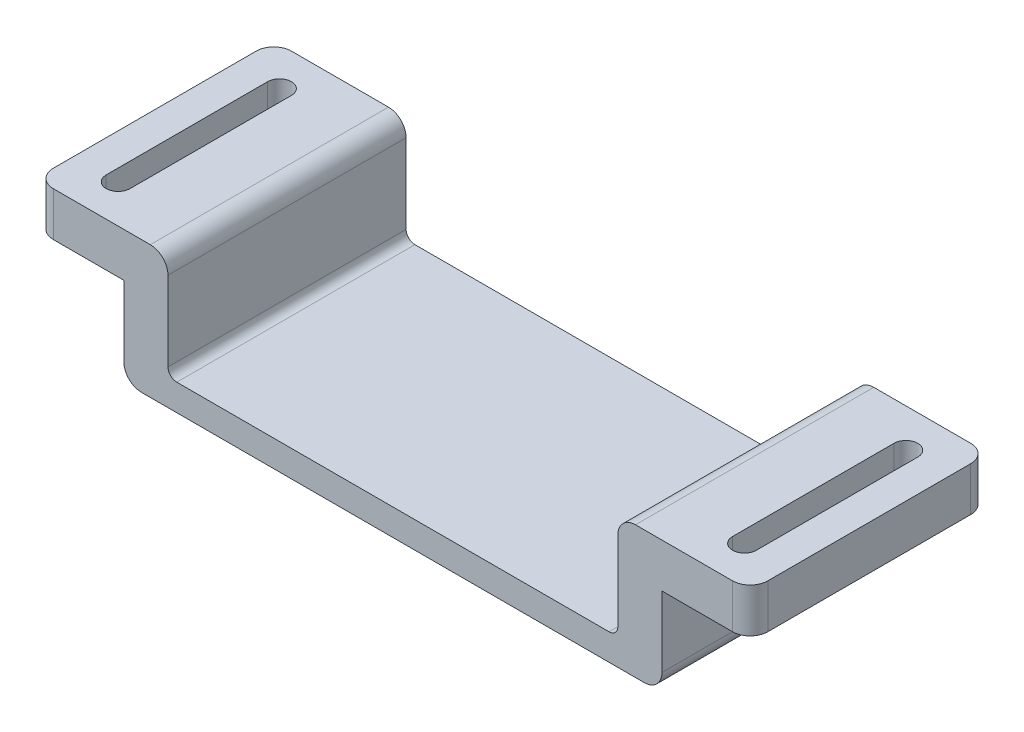
ISO-10303-21;
HEADER;
FILE_DESCRIPTION(('STEP AP214'),'2;1');
FILE_NAME('part.step','',(''),(''),'','','');
FILE_SCHEMA(('AUTOMOTIVE_DESIGN { 1 0 10303 214 1 1 1 1 }'));
ENDSEC;
DATA;
#1=APPLICATION_CONTEXT('core data for automotive mechanical design processes');
#2=APPLICATION_PROTOCOL_DEFINITION('international standard','automotive_design',2000,#1);
#3=PRODUCT_CONTEXT('',#1,'mechanical');
#4=PRODUCT('Part','Part','',(#3));
#5=PRODUCT_RELATED_PRODUCT_CATEGORY('part','',(#4));
#6=PRODUCT_DEFINITION_FORMATION('','',#4);
#7=PRODUCT_DEFINITION_CONTEXT('part definition',#1,'design');
#8=PRODUCT_DEFINITION('design','',#6,#7);
#9=PRODUCT_DEFINITION_SHAPE('','',#8);
#10=(LENGTH_UNIT() NAMED_UNIT(*) SI_UNIT(.MILLI.,.METRE.));
#11=(NAMED_UNIT(*) PLANE_ANGLE_UNIT() SI_UNIT($,.RADIAN.));
#12=(NAMED_UNIT(*) SI_UNIT($,.STERADIAN.) SOLID_ANGLE_UNIT());
#13=UNCERTAINTY_MEASURE_WITH_UNIT(LENGTH_MEASURE(1.E-05),#10,'distance_accuracy_value','');
#14=(GEOMETRIC_REPRESENTATION_CONTEXT(3) GLOBAL_UNCERTAINTY_ASSIGNED_CONTEXT((#13)) GLOBAL_UNIT_ASSIGNED_CONTEXT((#10,
#11,#12)) REPRESENTATION_CONTEXT('',''));
#15=CARTESIAN_POINT('',(0.,0.,0.));
#16=DIRECTION('',(0.,0.,1.));
#17=DIRECTION('',(1.,0.,0.));
#18=AXIS2_PLACEMENT_3D('',#15,#16,#17);
#19=CARTESIAN_POINT('',(0.,3.,0.));
#20=DIRECTION('',(0.,-1.,0.));
#21=DIRECTION('',(0.,0.,-1.));
#22=AXIS2_PLACEMENT_3D('',#19,#20,#21);
#23=PLANE('',#22);
#24=DIRECTION('',(-1.,0.,0.));
#25=VECTOR('',#24,1.);
#26=CARTESIAN_POINT('',(0.,3.,-27.));
#27=LINE('',#26,#25);
#28=CARTESIAN_POINT('',(55.,3.,-27.));
#29=VERTEX_POINT('',#28);
#30=CARTESIAN_POINT('',(6.,3.,-27.));
#31=VERTEX_POINT('',#30);
#32=EDGE_CURVE('E408',#29,#31,#27,.T.);
#33=ORIENTED_EDGE('',*,*,#32,.T.);
#34=DIRECTION('',(0.,0.,-1.));
#35=VECTOR('',#34,1.);
#36=CARTESIAN_POINT('',(6.,3.,0.));
#37=LINE('',#36,#35);
#38=CARTESIAN_POINT('',(6.,3.,0.));
#39=VERTEX_POINT('',#38);
#40=EDGE_CURVE('E548',#31,#39,#37,.F.);
#41=ORIENTED_EDGE('',*,*,#40,.T.);
#42=DIRECTION('',(1.,0.,0.));
#43=VECTOR('',#42,1.);
#44=CARTESIAN_POINT('',(0.,3.,0.));
#45=LINE('',#44,#43);
#46=CARTESIAN_POINT('',(55.,3.,0.));
#47=VERTEX_POINT('',#46);
#48=EDGE_CURVE('E404',#39,#47,#45,.T.);
#49=ORIENTED_EDGE('',*,*,#48,.T.);
#50=DIRECTION('',(0.,0.,1.));
#51=VECTOR('',#50,1.);
#52=CARTESIAN_POINT('',(55.,3.,-27.));
#53=LINE('',#52,#51);
#54=EDGE_CURVE('E545',#47,#29,#53,.F.);
#55=ORIENTED_EDGE('',*,*,#54,.T.);
#56=EDGE_LOOP('',(#33,#41,#49,#55));
#57=FACE_BOUND('',#56,.T.);
#58=ADVANCED_FACE('F39',(#57),#23,.F.);
#59=CARTESIAN_POINT('',(0.,3.,0.));
#60=DIRECTION('',(1.,0.,0.));
#61=DIRECTION('',(0.,0.,-1.));
#62=AXIS2_PLACEMENT_3D('',#59,#60,#61);
#63=PLANE('',#62);
#64=DIRECTION('',(0.,-1.,0.));
#65=VECTOR('',#64,1.);
#66=CARTESIAN_POINT('',(0.,3.,-27.));
#67=LINE('',#66,#65);
#68=CARTESIAN_POINT('',(0.,10.,-27.));
#69=VERTEX_POINT('',#68);
#70=CARTESIAN_POINT('',(0.,2.,-27.));
#71=VERTEX_POINT('',#70);
#72=EDGE_CURVE('E413',#69,#71,#67,.T.);
#73=ORIENTED_EDGE('',*,*,#72,.T.);
#74=DIRECTION('',(0.,0.,1.));
#75=VECTOR('',#74,1.);
#76=CARTESIAN_POINT('',(0.,2.,0.));
#77=LINE('',#76,#75);
#78=CARTESIAN_POINT('',(0.,2.,0.));
#79=VERTEX_POINT('',#78);
#80=EDGE_CURVE('E489',#71,#79,#77,.T.);
#81=ORIENTED_EDGE('',*,*,#80,.T.);
#82=DIRECTION('',(0.,-1.,0.));
#83=VECTOR('',#82,1.);
#84=CARTESIAN_POINT('',(0.,3.,0.));
#85=LINE('',#84,#83);
#86=CARTESIAN_POINT('',(0.,10.,0.));
#87=VERTEX_POINT('',#86);
#88=EDGE_CURVE('E431',#87,#79,#85,.T.);
#89=ORIENTED_EDGE('',*,*,#88,.F.);
#90=DIRECTION('',(0.,0.,1.));
#91=VECTOR('',#90,1.);
#92=CARTESIAN_POINT('',(0.,10.,-27.));
#93=LINE('',#92,#91);
#94=EDGE_CURVE('E391',#69,#87,#93,.T.);
#95=ORIENTED_EDGE('',*,*,#94,.F.);
#96=EDGE_LOOP('',(#73,#81,#89,#95));
#97=FACE_BOUND('',#96,.T.);
#98=ADVANCED_FACE('F617',(#97),#63,.F.);
#99=CARTESIAN_POINT('',(0.,3.,0.));
#100=DIRECTION('',(0.,0.,-1.));
#101=DIRECTION('',(-1.,0.,0.));
#102=AXIS2_PLACEMENT_3D('',#99,#100,#101);
#103=PLANE('',#102);
#104=ORIENTED_EDGE('',*,*,#88,.T.);
#105=CARTESIAN_POINT('',(2.,2.,0.));
#106=DIRECTION('',(0.,0.,-1.));
#107=DIRECTION('',(-1.,0.,0.));
#108=AXIS2_PLACEMENT_3D('',#105,#106,#107);
#109=CIRCLE('',#108,2.);
#110=CARTESIAN_POINT('',(2.,0.,0.));
#111=VERTEX_POINT('',#110);
#112=EDGE_CURVE('E502',#79,#111,#109,.F.);
#113=ORIENTED_EDGE('',*,*,#112,.T.);
#114=DIRECTION('',(1.,0.,0.));
#115=VECTOR('',#114,1.);
#116=CARTESIAN_POINT('',(0.,0.,0.));
#117=LINE('',#116,#115);
#118=CARTESIAN_POINT('',(59.,0.,0.));
#119=VERTEX_POINT('',#118);
#120=EDGE_CURVE('E403',#111,#119,#117,.T.);
#121=ORIENTED_EDGE('',*,*,#120,.T.);
#122=CARTESIAN_POINT('',(59.,2.,0.));
#123=DIRECTION('',(0.,0.,-1.));
#124=DIRECTION('',(-1.,0.,0.));
#125=AXIS2_PLACEMENT_3D('',#122,#123,#124);
#126=CIRCLE('',#125,2.);
#127=CARTESIAN_POINT('',(61.,2.,0.));
#128=VERTEX_POINT('',#127);
#129=EDGE_CURVE('E496',#119,#128,#126,.F.);
#130=ORIENTED_EDGE('',*,*,#129,.T.);
#131=DIRECTION('',(0.,-1.,0.));
#132=VECTOR('',#131,1.);
#133=CARTESIAN_POINT('',(61.,3.,0.));
#134=LINE('',#133,#132);
#135=CARTESIAN_POINT('',(61.,10.,0.));
#136=VERTEX_POINT('',#135);
#137=EDGE_CURVE('E427',#136,#128,#134,.T.);
#138=ORIENTED_EDGE('',*,*,#137,.F.);
#139=DIRECTION('',(1.,0.,0.));
#140=VECTOR('',#139,1.);
#141=CARTESIAN_POINT('',(56.,10.,0.));
#142=LINE('',#141,#140);
#143=CARTESIAN_POINT('',(69.,10.,0.));
#144=VERTEX_POINT('',#143);
#145=EDGE_CURVE('E288',#136,#144,#142,.T.);
#146=ORIENTED_EDGE('',*,*,#145,.T.);
#147=DIRECTION('',(0.,-1.,0.));
#148=VECTOR('',#147,1.);
#149=CARTESIAN_POINT('',(69.,3.,0.));
#150=LINE('',#149,#148);
#151=CARTESIAN_POINT('',(69.,15.,0.));
#152=VERTEX_POINT('',#151);
#153=EDGE_CURVE('E452',#144,#152,#150,.F.);
#154=ORIENTED_EDGE('',*,*,#153,.T.);
#155=DIRECTION('',(1.,0.,0.));
#156=VECTOR('',#155,1.);
#157=CARTESIAN_POINT('',(56.,15.,0.));
#158=LINE('',#157,#156);
#159=CARTESIAN_POINT('',(58.,15.,0.));
#160=VERTEX_POINT('',#159);
#161=EDGE_CURVE('E337',#160,#152,#158,.T.);
#162=ORIENTED_EDGE('',*,*,#161,.F.);
#163=CARTESIAN_POINT('',(58.,13.,0.));
#164=DIRECTION('',(0.,0.,-1.));
#165=DIRECTION('',(-1.,0.,0.));
#166=AXIS2_PLACEMENT_3D('',#163,#164,#165);
#167=CIRCLE('',#166,2.);
#168=CARTESIAN_POINT('',(56.,13.,0.));
#169=VERTEX_POINT('',#168);
#170=EDGE_CURVE('E493',#160,#169,#167,.F.);
#171=ORIENTED_EDGE('',*,*,#170,.T.);
#172=DIRECTION('',(0.,-1.,0.));
#173=VECTOR('',#172,1.);
#174=CARTESIAN_POINT('',(56.,10.,0.));
#175=LINE('',#174,#173);
#176=CARTESIAN_POINT('',(56.,4.,0.));
#177=VERTEX_POINT('',#176);
#178=EDGE_CURVE('E384',#169,#177,#175,.T.);
#179=ORIENTED_EDGE('',*,*,#178,.T.);
#180=CARTESIAN_POINT('',(55.,4.,0.));
#181=DIRECTION('',(0.,0.,-1.));
#182=DIRECTION('',(-1.,0.,0.));
#183=AXIS2_PLACEMENT_3D('',#180,#181,#182);
#184=CIRCLE('',#183,1.);
#185=EDGE_CURVE('E48',#177,#47,#184,.T.);
#186=ORIENTED_EDGE('',*,*,#185,.T.);
#187=ORIENTED_EDGE('',*,*,#48,.F.);
#188=CARTESIAN_POINT('',(6.,4.,0.));
#189=DIRECTION('',(0.,0.,-1.));
#190=DIRECTION('',(-1.,0.,0.));
#191=AXIS2_PLACEMENT_3D('',#188,#189,#190);
#192=CIRCLE('',#191,1.);
#193=CARTESIAN_POINT('',(5.,4.,0.));
#194=VERTEX_POINT('',#193);
#195=EDGE_CURVE('E557',#39,#194,#192,.T.);
#196=ORIENTED_EDGE('',*,*,#195,.T.);
#197=DIRECTION('',(0.,-1.,0.));
#198=VECTOR('',#197,1.);
#199=CARTESIAN_POINT('',(5.,10.,0.));
#200=LINE('',#199,#198);
#201=CARTESIAN_POINT('',(5.,13.,0.));
#202=VERTEX_POINT('',#201);
#203=EDGE_CURVE('E399',#202,#194,#200,.T.);
#204=ORIENTED_EDGE('',*,*,#203,.F.);
#205=CARTESIAN_POINT('',(3.,13.,0.));
#206=DIRECTION('',(0.,0.,-1.));
#207=DIRECTION('',(-1.,0.,0.));
#208=AXIS2_PLACEMENT_3D('',#205,#206,#207);
#209=CIRCLE('',#208,2.);
#210=CARTESIAN_POINT('',(3.,15.,0.));
#211=VERTEX_POINT('',#210);
#212=EDGE_CURVE('E499',#202,#211,#209,.F.);
#213=ORIENTED_EDGE('',*,*,#212,.T.);
#214=DIRECTION('',(1.,0.,0.));
#215=VECTOR('',#214,1.);
#216=CARTESIAN_POINT('',(5.,15.,0.));
#217=LINE('',#216,#215);
#218=CARTESIAN_POINT('',(-7.99999999999999,15.,0.));
#219=VERTEX_POINT('',#218);
#220=EDGE_CURVE('E367',#219,#211,#217,.T.);
#221=ORIENTED_EDGE('',*,*,#220,.F.);
#222=DIRECTION('',(0.,-1.,0.));
#223=VECTOR('',#222,1.);
#224=CARTESIAN_POINT('',(-7.99999999999999,3.,0.));
#225=LINE('',#224,#223);
#226=CARTESIAN_POINT('',(-7.99999999999999,10.,0.));
#227=VERTEX_POINT('',#226);
#228=EDGE_CURVE('E448',#219,#227,#225,.T.);
#229=ORIENTED_EDGE('',*,*,#228,.T.);
#230=DIRECTION('',(1.,0.,0.));
#231=VECTOR('',#230,1.);
#232=CARTESIAN_POINT('',(5.,10.,0.));
#233=LINE('',#232,#231);
#234=EDGE_CURVE('E363',#227,#87,#233,.T.);
#235=ORIENTED_EDGE('',*,*,#234,.T.);
#236=EDGE_LOOP('',(#104,#113,#121,#130,#138,#146,#154,#162,#171,#179,#186,#187,#196,#204,#213,
#221,#229,#235));
#237=FACE_BOUND('',#236,.T.);
#238=ADVANCED_FACE('F562',(#237),#103,.F.);
#239=CARTESIAN_POINT('',(61.,3.,0.));
#240=DIRECTION('',(-1.,0.,0.));
#241=DIRECTION('',(0.,0.,1.));
#242=AXIS2_PLACEMENT_3D('',#239,#240,#241);
#243=PLANE('',#242);
#244=ORIENTED_EDGE('',*,*,#137,.T.);
#245=DIRECTION('',(0.,0.,-1.));
#246=VECTOR('',#245,1.);
#247=CARTESIAN_POINT('',(61.,2.,-27.));
#248=LINE('',#247,#246);
#249=CARTESIAN_POINT('',(61.,2.,-27.));
#250=VERTEX_POINT('',#249);
#251=EDGE_CURVE('E530',#128,#250,#248,.T.);
#252=ORIENTED_EDGE('',*,*,#251,.T.);
#253=DIRECTION('',(0.,-1.,0.));
#254=VECTOR('',#253,1.);
#255=CARTESIAN_POINT('',(61.,3.,-27.));
#256=LINE('',#255,#254);
#257=CARTESIAN_POINT('',(61.,10.,-27.));
#258=VERTEX_POINT('',#257);
#259=EDGE_CURVE('E423',#258,#250,#256,.T.);
#260=ORIENTED_EDGE('',*,*,#259,.F.);
#261=DIRECTION('',(0.,0.,-1.));
#262=VECTOR('',#261,1.);
#263=CARTESIAN_POINT('',(61.,10.,-27.));
#264=LINE('',#263,#262);
#265=EDGE_CURVE('E371',#136,#258,#264,.T.);
#266=ORIENTED_EDGE('',*,*,#265,.F.);
#267=EDGE_LOOP('',(#244,#252,#260,#266));
#268=FACE_BOUND('',#267,.T.);
#269=ADVANCED_FACE('F600',(#268),#243,.F.);
#270=CARTESIAN_POINT('',(0.,3.,-27.));
#271=DIRECTION('',(0.,0.,1.));
#272=DIRECTION('',(1.,0.,0.));
#273=AXIS2_PLACEMENT_3D('',#270,#271,#272);
#274=PLANE('',#273);
#275=DIRECTION('',(-1.,0.,0.));
#276=VECTOR('',#275,1.);
#277=CARTESIAN_POINT('',(0.,0.,-27.));
#278=LINE('',#277,#276);
#279=CARTESIAN_POINT('',(59.,0.,-27.));
#280=VERTEX_POINT('',#279);
#281=CARTESIAN_POINT('',(1.99999999999999,0.,-27.));
#282=VERTEX_POINT('',#281);
#283=EDGE_CURVE('E409',#280,#282,#278,.T.);
#284=ORIENTED_EDGE('',*,*,#283,.T.);
#285=CARTESIAN_POINT('',(1.99999999999999,2.,-27.));
#286=DIRECTION('',(0.,0.,1.));
#287=DIRECTION('',(1.,0.,0.));
#288=AXIS2_PLACEMENT_3D('',#285,#286,#287);
#289=CIRCLE('',#288,2.);
#290=EDGE_CURVE('E520',#282,#71,#289,.F.);
#291=ORIENTED_EDGE('',*,*,#290,.T.);
#292=ORIENTED_EDGE('',*,*,#72,.F.);
#293=DIRECTION('',(-1.,0.,0.));
#294=VECTOR('',#293,1.);
#295=CARTESIAN_POINT('',(5.,10.,-27.));
#296=LINE('',#295,#294);
#297=CARTESIAN_POINT('',(-8.,10.,-27.));
#298=VERTEX_POINT('',#297);
#299=EDGE_CURVE('E349',#69,#298,#296,.T.);
#300=ORIENTED_EDGE('',*,*,#299,.T.);
#301=DIRECTION('',(0.,-1.,0.));
#302=VECTOR('',#301,1.);
#303=CARTESIAN_POINT('',(-8.,3.,-27.));
#304=LINE('',#303,#302);
#305=CARTESIAN_POINT('',(-8.,15.,-27.));
#306=VERTEX_POINT('',#305);
#307=EDGE_CURVE('E462',#298,#306,#304,.F.);
#308=ORIENTED_EDGE('',*,*,#307,.T.);
#309=DIRECTION('',(-1.,0.,0.));
#310=VECTOR('',#309,1.);
#311=CARTESIAN_POINT('',(5.,15.,-27.));
#312=LINE('',#311,#310);
#313=CARTESIAN_POINT('',(3.,15.,-27.));
#314=VERTEX_POINT('',#313);
#315=EDGE_CURVE('E359',#314,#306,#312,.T.);
#316=ORIENTED_EDGE('',*,*,#315,.F.);
#317=CARTESIAN_POINT('',(3.,13.,-27.));
#318=DIRECTION('',(0.,0.,1.));
#319=DIRECTION('',(1.,0.,0.));
#320=AXIS2_PLACEMENT_3D('',#317,#318,#319);
#321=CIRCLE('',#320,2.);
#322=CARTESIAN_POINT('',(5.,13.,-27.));
#323=VERTEX_POINT('',#322);
#324=EDGE_CURVE('E517',#314,#323,#321,.F.);
#325=ORIENTED_EDGE('',*,*,#324,.T.);
#326=DIRECTION('',(0.,-1.,0.));
#327=VECTOR('',#326,1.);
#328=CARTESIAN_POINT('',(5.,10.,-27.));
#329=LINE('',#328,#327);
#330=CARTESIAN_POINT('',(5.,4.,-27.));
#331=VERTEX_POINT('',#330);
#332=EDGE_CURVE('E395',#323,#331,#329,.T.);
#333=ORIENTED_EDGE('',*,*,#332,.T.);
#334=CARTESIAN_POINT('',(6.,4.,-27.));
#335=DIRECTION('',(0.,0.,1.));
#336=DIRECTION('',(1.,0.,0.));
#337=AXIS2_PLACEMENT_3D('',#334,#335,#336);
#338=CIRCLE('',#337,1.);
#339=EDGE_CURVE('E554',#331,#31,#338,.T.);
#340=ORIENTED_EDGE('',*,*,#339,.T.);
#341=ORIENTED_EDGE('',*,*,#32,.F.);
#342=CARTESIAN_POINT('',(55.,4.,-27.));
#343=DIRECTION('',(0.,0.,1.));
#344=DIRECTION('',(1.,0.,0.));
#345=AXIS2_PLACEMENT_3D('',#342,#343,#344);
#346=CIRCLE('',#345,1.);
#347=CARTESIAN_POINT('',(56.,4.,-27.));
#348=VERTEX_POINT('',#347);
#349=EDGE_CURVE('E11',#29,#348,#346,.T.);
#350=ORIENTED_EDGE('',*,*,#349,.T.);
#351=DIRECTION('',(0.,-1.,0.));
#352=VECTOR('',#351,1.);
#353=CARTESIAN_POINT('',(56.,10.,-27.));
#354=LINE('',#353,#352);
#355=CARTESIAN_POINT('',(56.,13.,-27.));
#356=VERTEX_POINT('',#355);
#357=EDGE_CURVE('E388',#356,#348,#354,.T.);
#358=ORIENTED_EDGE('',*,*,#357,.F.);
#359=CARTESIAN_POINT('',(58.,13.,-27.));
#360=DIRECTION('',(0.,0.,1.));
#361=DIRECTION('',(1.,0.,0.));
#362=AXIS2_PLACEMENT_3D('',#359,#360,#361);
#363=CIRCLE('',#362,2.);
#364=CARTESIAN_POINT('',(58.,15.,-27.));
#365=VERTEX_POINT('',#364);
#366=EDGE_CURVE('E511',#356,#365,#363,.F.);
#367=ORIENTED_EDGE('',*,*,#366,.T.);
#368=DIRECTION('',(-1.,0.,0.));
#369=VECTOR('',#368,1.);
#370=CARTESIAN_POINT('',(56.,15.,-27.));
#371=LINE('',#370,#369);
#372=CARTESIAN_POINT('',(69.,15.,-27.));
#373=VERTEX_POINT('',#372);
#374=EDGE_CURVE('E345',#373,#365,#371,.T.);
#375=ORIENTED_EDGE('',*,*,#374,.F.);
#376=DIRECTION('',(0.,-1.,0.));
#377=VECTOR('',#376,1.);
#378=CARTESIAN_POINT('',(69.,3.,-27.));
#379=LINE('',#378,#377);
#380=CARTESIAN_POINT('',(69.,10.,-27.));
#381=VERTEX_POINT('',#380);
#382=EDGE_CURVE('E466',#373,#381,#379,.T.);
#383=ORIENTED_EDGE('',*,*,#382,.T.);
#384=DIRECTION('',(-1.,0.,0.));
#385=VECTOR('',#384,1.);
#386=CARTESIAN_POINT('',(56.,10.,-27.));
#387=LINE('',#386,#385);
#388=EDGE_CURVE('E341',#381,#258,#387,.T.);
#389=ORIENTED_EDGE('',*,*,#388,.T.);
#390=ORIENTED_EDGE('',*,*,#259,.T.);
#391=CARTESIAN_POINT('',(59.,2.,-27.));
#392=DIRECTION('',(0.,0.,1.));
#393=DIRECTION('',(1.,0.,0.));
#394=AXIS2_PLACEMENT_3D('',#391,#392,#393);
#395=CIRCLE('',#394,2.);
#396=EDGE_CURVE('E514',#250,#280,#395,.F.);
#397=ORIENTED_EDGE('',*,*,#396,.T.);
#398=EDGE_LOOP('',(#284,#291,#292,#300,#308,#316,#325,#333,#340,#341,#350,#358,#367,#375,#383,
#389,#390,#397));
#399=FACE_BOUND('',#398,.T.);
#400=ADVANCED_FACE('F571',(#399),#274,.F.);
#401=CARTESIAN_POINT('',(0.,0.,0.));
#402=DIRECTION('',(0.,-1.,0.));
#403=DIRECTION('',(0.,0.,-1.));
#404=AXIS2_PLACEMENT_3D('',#401,#402,#403);
#405=PLANE('',#404);
#406=ORIENTED_EDGE('',*,*,#120,.F.);
#407=DIRECTION('',(0.,0.,1.));
#408=VECTOR('',#407,1.);
#409=CARTESIAN_POINT('',(1.99999999999999,0.,-27.));
#410=LINE('',#409,#408);
#411=EDGE_CURVE('E508',#111,#282,#410,.F.);
#412=ORIENTED_EDGE('',*,*,#411,.T.);
#413=ORIENTED_EDGE('',*,*,#283,.F.);
#414=DIRECTION('',(0.,0.,-1.));
#415=VECTOR('',#414,1.);
#416=CARTESIAN_POINT('',(59.,0.,0.));
#417=LINE('',#416,#415);
#418=EDGE_CURVE('E505',#280,#119,#417,.F.);
#419=ORIENTED_EDGE('',*,*,#418,.T.);
#420=EDGE_LOOP('',(#406,#412,#413,#419));
#421=FACE_BOUND('',#420,.T.);
#422=ADVANCED_FACE('F608',(#421),#405,.T.);
#423=CARTESIAN_POINT('',(5.,10.,-27.));
#424=DIRECTION('',(-1.,0.,0.));
#425=DIRECTION('',(0.,0.,1.));
#426=AXIS2_PLACEMENT_3D('',#423,#424,#425);
#427=PLANE('',#426);
#428=ORIENTED_EDGE('',*,*,#203,.T.);
#429=DIRECTION('',(0.,0.,-1.));
#430=VECTOR('',#429,1.);
#431=CARTESIAN_POINT('',(5.,4.,-27.));
#432=LINE('',#431,#430);
#433=EDGE_CURVE('E541',#194,#331,#432,.T.);
#434=ORIENTED_EDGE('',*,*,#433,.T.);
#435=ORIENTED_EDGE('',*,*,#332,.F.);
#436=DIRECTION('',(0.,0.,-1.));
#437=VECTOR('',#436,1.);
#438=CARTESIAN_POINT('',(5.,13.,-27.));
#439=LINE('',#438,#437);
#440=EDGE_CURVE('E527',#323,#202,#439,.F.);
#441=ORIENTED_EDGE('',*,*,#440,.T.);
#442=EDGE_LOOP('',(#428,#434,#435,#441));
#443=FACE_BOUND('',#442,.T.);
#444=ADVANCED_FACE('F647',(#443),#427,.F.);
#445=CARTESIAN_POINT('',(56.,10.,-27.));
#446=DIRECTION('',(1.,0.,0.));
#447=DIRECTION('',(0.,0.,-1.));
#448=AXIS2_PLACEMENT_3D('',#445,#446,#447);
#449=PLANE('',#448);
#450=ORIENTED_EDGE('',*,*,#357,.T.);
#451=DIRECTION('',(0.,0.,1.));
#452=VECTOR('',#451,1.);
#453=CARTESIAN_POINT('',(56.,4.,0.));
#454=LINE('',#453,#452);
#455=EDGE_CURVE('E551',#348,#177,#454,.T.);
#456=ORIENTED_EDGE('',*,*,#455,.T.);
#457=ORIENTED_EDGE('',*,*,#178,.F.);
#458=DIRECTION('',(0.,0.,1.));
#459=VECTOR('',#458,1.);
#460=CARTESIAN_POINT('',(56.,13.,-27.));
#461=LINE('',#460,#459);
#462=EDGE_CURVE('E538',#169,#356,#461,.F.);
#463=ORIENTED_EDGE('',*,*,#462,.T.);
#464=EDGE_LOOP('',(#450,#456,#457,#463));
#465=FACE_BOUND('',#464,.T.);
#466=ADVANCED_FACE('F568',(#465),#449,.F.);
#467=CARTESIAN_POINT('',(0.,10.,0.));
#468=DIRECTION('',(0.,-1.,0.));
#469=DIRECTION('',(0.,0.,-1.));
#470=AXIS2_PLACEMENT_3D('',#467,#468,#469);
#471=PLANE('',#470);
#472=CARTESIAN_POINT('',(-5.00000000000001,10.,-4.35));
#473=DIRECTION('',(0.,-1.,0.));
#474=DIRECTION('',(0.,0.,-1.));
#475=AXIS2_PLACEMENT_3D('',#472,#473,#474);
#476=CIRCLE('',#475,1.35);
#477=CARTESIAN_POINT('',(-3.65000000000001,10.,-4.35));
#478=VERTEX_POINT('',#477);
#479=CARTESIAN_POINT('',(-6.35,10.,-4.35));
#480=VERTEX_POINT('',#479);
#481=EDGE_CURVE('E244',#478,#480,#476,.T.);
#482=ORIENTED_EDGE('',*,*,#481,.F.);
#483=DIRECTION('',(0.,0.,1.));
#484=VECTOR('',#483,1.);
#485=CARTESIAN_POINT('',(-3.65000000000001,10.,-4.35));
#486=LINE('',#485,#484);
#487=CARTESIAN_POINT('',(-3.65,10.,-22.65));
#488=VERTEX_POINT('',#487);
#489=EDGE_CURVE('E265',#488,#478,#486,.T.);
#490=ORIENTED_EDGE('',*,*,#489,.F.);
#491=CARTESIAN_POINT('',(-5.,10.,-22.65));
#492=DIRECTION('',(0.,-1.,0.));
#493=DIRECTION('',(0.,0.,-1.));
#494=AXIS2_PLACEMENT_3D('',#491,#492,#493);
#495=CIRCLE('',#494,1.35);
#496=CARTESIAN_POINT('',(-6.35,10.,-22.65));
#497=VERTEX_POINT('',#496);
#498=EDGE_CURVE('E269',#497,#488,#495,.T.);
#499=ORIENTED_EDGE('',*,*,#498,.F.);
#500=DIRECTION('',(0.,0.,-1.));
#501=VECTOR('',#500,1.);
#502=CARTESIAN_POINT('',(-6.35,10.,-4.35));
#503=LINE('',#502,#501);
#504=EDGE_CURVE('E278',#480,#497,#503,.T.);
#505=ORIENTED_EDGE('',*,*,#504,.F.);
#506=EDGE_LOOP('',(#482,#490,#499,#505));
#507=FACE_BOUND('',#506,.T.);
#508=DIRECTION('',(0.,0.,1.));
#509=VECTOR('',#508,1.);
#510=CARTESIAN_POINT('',(-10.,10.,-27.));
#511=LINE('',#510,#509);
#512=CARTESIAN_POINT('',(-10.,10.,-25.));
#513=VERTEX_POINT('',#512);
#514=CARTESIAN_POINT('',(-9.99999999999999,10.,-2.));
#515=VERTEX_POINT('',#514);
#516=EDGE_CURVE('E375',#513,#515,#511,.T.);
#517=ORIENTED_EDGE('',*,*,#516,.F.);
#518=CARTESIAN_POINT('',(-8.,10.,-25.));
#519=DIRECTION('',(0.,-1.,0.));
#520=DIRECTION('',(0.,0.,-1.));
#521=AXIS2_PLACEMENT_3D('',#518,#519,#520);
#522=CIRCLE('',#521,2.);
#523=EDGE_CURVE('E480',#513,#298,#522,.T.);
#524=ORIENTED_EDGE('',*,*,#523,.T.);
#525=ORIENTED_EDGE('',*,*,#299,.F.);
#526=ORIENTED_EDGE('',*,*,#94,.T.);
#527=ORIENTED_EDGE('',*,*,#234,.F.);
#528=CARTESIAN_POINT('',(-7.99999999999999,10.,-2.));
#529=DIRECTION('',(0.,-1.,0.));
#530=DIRECTION('',(0.,0.,-1.));
#531=AXIS2_PLACEMENT_3D('',#528,#529,#530);
#532=CIRCLE('',#531,2.);
#533=EDGE_CURVE('E477',#227,#515,#532,.T.);
#534=ORIENTED_EDGE('',*,*,#533,.T.);
#535=EDGE_LOOP('',(#517,#524,#525,#526,#527,#534));
#536=FACE_BOUND('',#535,.T.);
#537=ADVANCED_FACE('F623',(#507,#536),#471,.T.);
#538=CARTESIAN_POINT('',(-10.,15.,-27.));
#539=DIRECTION('',(1.,0.,0.));
#540=DIRECTION('',(0.,0.,-1.));
#541=AXIS2_PLACEMENT_3D('',#538,#539,#540);
#542=PLANE('',#541);
#543=DIRECTION('',(0.,0.,1.));
#544=VECTOR('',#543,1.);
#545=CARTESIAN_POINT('',(-10.,15.,-27.));
#546=LINE('',#545,#544);
#547=CARTESIAN_POINT('',(-10.,15.,-25.));
#548=VERTEX_POINT('',#547);
#549=CARTESIAN_POINT('',(-9.99999999999999,15.,-2.));
#550=VERTEX_POINT('',#549);
#551=EDGE_CURVE('E362',#548,#550,#546,.T.);
#552=ORIENTED_EDGE('',*,*,#551,.F.);
#553=DIRECTION('',(0.,-1.,0.));
#554=VECTOR('',#553,1.);
#555=CARTESIAN_POINT('',(-10.,15.,-25.));
#556=LINE('',#555,#554);
#557=EDGE_CURVE('E473',#548,#513,#556,.T.);
#558=ORIENTED_EDGE('',*,*,#557,.T.);
#559=ORIENTED_EDGE('',*,*,#516,.T.);
#560=DIRECTION('',(0.,-1.,0.));
#561=VECTOR('',#560,1.);
#562=CARTESIAN_POINT('',(-9.99999999999999,15.,-2.));
#563=LINE('',#562,#561);
#564=EDGE_CURVE('E470',#515,#550,#563,.F.);
#565=ORIENTED_EDGE('',*,*,#564,.T.);
#566=EDGE_LOOP('',(#552,#558,#559,#565));
#567=FACE_BOUND('',#566,.T.);
#568=ADVANCED_FACE('F633',(#567),#542,.F.);
#569=CARTESIAN_POINT('',(0.,15.,0.));
#570=DIRECTION('',(0.,-1.,0.));
#571=DIRECTION('',(0.,0.,-1.));
#572=AXIS2_PLACEMENT_3D('',#569,#570,#571);
#573=PLANE('',#572);
#574=DIRECTION('',(0.,0.,1.));
#575=VECTOR('',#574,1.);
#576=CARTESIAN_POINT('',(-3.65000000000001,15.,-4.35));
#577=LINE('',#576,#575);
#578=CARTESIAN_POINT('',(-3.65,15.,-22.65));
#579=VERTEX_POINT('',#578);
#580=CARTESIAN_POINT('',(-3.65000000000001,15.,-4.35));
#581=VERTEX_POINT('',#580);
#582=EDGE_CURVE('E250',#579,#581,#577,.T.);
#583=ORIENTED_EDGE('',*,*,#582,.T.);
#584=CARTESIAN_POINT('',(-5.00000000000001,15.,-4.35));
#585=DIRECTION('',(0.,-1.,0.));
#586=DIRECTION('',(0.,0.,-1.));
#587=AXIS2_PLACEMENT_3D('',#584,#585,#586);
#588=CIRCLE('',#587,1.35);
#589=CARTESIAN_POINT('',(-6.35,15.,-4.35));
#590=VERTEX_POINT('',#589);
#591=EDGE_CURVE('E241',#581,#590,#588,.T.);
#592=ORIENTED_EDGE('',*,*,#591,.T.);
#593=DIRECTION('',(0.,0.,-1.));
#594=VECTOR('',#593,1.);
#595=CARTESIAN_POINT('',(-6.35,15.,-4.35));
#596=LINE('',#595,#594);
#597=CARTESIAN_POINT('',(-6.35,15.,-22.65));
#598=VERTEX_POINT('',#597);
#599=EDGE_CURVE('E254',#590,#598,#596,.T.);
#600=ORIENTED_EDGE('',*,*,#599,.T.);
#601=CARTESIAN_POINT('',(-5.,15.,-22.65));
#602=DIRECTION('',(0.,-1.,0.));
#603=DIRECTION('',(0.,0.,-1.));
#604=AXIS2_PLACEMENT_3D('',#601,#602,#603);
#605=CIRCLE('',#604,1.35);
#606=EDGE_CURVE('E259',#598,#579,#605,.T.);
#607=ORIENTED_EDGE('',*,*,#606,.T.);
#608=EDGE_LOOP('',(#583,#592,#600,#607));
#609=FACE_BOUND('',#608,.T.);
#610=ORIENTED_EDGE('',*,*,#220,.T.);
#611=DIRECTION('',(0.,0.,-1.));
#612=VECTOR('',#611,1.);
#613=CARTESIAN_POINT('',(3.,15.,0.));
#614=LINE('',#613,#612);
#615=EDGE_CURVE('E523',#211,#314,#614,.T.);
#616=ORIENTED_EDGE('',*,*,#615,.T.);
#617=ORIENTED_EDGE('',*,*,#315,.T.);
#618=CARTESIAN_POINT('',(-8.,15.,-25.));
#619=DIRECTION('',(0.,-1.,0.));
#620=DIRECTION('',(0.,0.,-1.));
#621=AXIS2_PLACEMENT_3D('',#618,#619,#620);
#622=CIRCLE('',#621,2.);
#623=EDGE_CURVE('E486',#306,#548,#622,.F.);
#624=ORIENTED_EDGE('',*,*,#623,.T.);
#625=ORIENTED_EDGE('',*,*,#551,.T.);
#626=CARTESIAN_POINT('',(-7.99999999999999,15.,-2.));
#627=DIRECTION('',(0.,-1.,0.));
#628=DIRECTION('',(0.,0.,-1.));
#629=AXIS2_PLACEMENT_3D('',#626,#627,#628);
#630=CIRCLE('',#629,2.);
#631=EDGE_CURVE('E483',#550,#219,#630,.F.);
#632=ORIENTED_EDGE('',*,*,#631,.T.);
#633=EDGE_LOOP('',(#610,#616,#617,#624,#625,#632));
#634=FACE_BOUND('',#633,.T.);
#635=ADVANCED_FACE('F261',(#609,#634),#573,.F.);
#636=CARTESIAN_POINT('',(0.,10.,0.));
#637=DIRECTION('',(0.,1.,0.));
#638=DIRECTION('',(0.,0.,1.));
#639=AXIS2_PLACEMENT_3D('',#636,#637,#638);
#640=PLANE('',#639);
#641=DIRECTION('',(0.,0.,-1.));
#642=VECTOR('',#641,1.);
#643=CARTESIAN_POINT('',(64.65,10.,-4.35000000000001));
#644=LINE('',#643,#642);
#645=CARTESIAN_POINT('',(64.65,10.,-4.35000000000001));
#646=VERTEX_POINT('',#645);
#647=CARTESIAN_POINT('',(64.65,10.,-22.65));
#648=VERTEX_POINT('',#647);
#649=EDGE_CURVE('E315',#646,#648,#644,.T.);
#650=ORIENTED_EDGE('',*,*,#649,.F.);
#651=CARTESIAN_POINT('',(66.,10.,-4.35000000000001));
#652=DIRECTION('',(0.,-1.,0.));
#653=DIRECTION('',(0.,0.,-1.));
#654=AXIS2_PLACEMENT_3D('',#651,#652,#653);
#655=CIRCLE('',#654,1.35000000000002);
#656=CARTESIAN_POINT('',(67.35,10.,-4.35000000000001));
#657=VERTEX_POINT('',#656);
#658=EDGE_CURVE('E312',#657,#646,#655,.T.);
#659=ORIENTED_EDGE('',*,*,#658,.F.);
#660=DIRECTION('',(0.,0.,1.));
#661=VECTOR('',#660,1.);
#662=CARTESIAN_POINT('',(67.35,10.,-4.35000000000001));
#663=LINE('',#662,#661);
#664=CARTESIAN_POINT('',(67.35,10.,-22.65));
#665=VERTEX_POINT('',#664);
#666=EDGE_CURVE('E299',#665,#657,#663,.T.);
#667=ORIENTED_EDGE('',*,*,#666,.F.);
#668=CARTESIAN_POINT('',(66.,10.,-22.65));
#669=DIRECTION('',(0.,-1.,0.));
#670=DIRECTION('',(0.,0.,-1.));
#671=AXIS2_PLACEMENT_3D('',#668,#669,#670);
#672=CIRCLE('',#671,1.35000000000002);
#673=EDGE_CURVE('E319',#648,#665,#672,.T.);
#674=ORIENTED_EDGE('',*,*,#673,.F.);
#675=EDGE_LOOP('',(#650,#659,#667,#674));
#676=FACE_BOUND('',#675,.T.);
#677=DIRECTION('',(0.,0.,-1.));
#678=VECTOR('',#677,1.);
#679=CARTESIAN_POINT('',(71.,10.,-27.));
#680=LINE('',#679,#678);
#681=CARTESIAN_POINT('',(71.,10.,-2.));
#682=VERTEX_POINT('',#681);
#683=CARTESIAN_POINT('',(71.,10.,-25.));
#684=VERTEX_POINT('',#683);
#685=EDGE_CURVE('E353',#682,#684,#680,.T.);
#686=ORIENTED_EDGE('',*,*,#685,.F.);
#687=CARTESIAN_POINT('',(69.,10.,-2.));
#688=DIRECTION('',(0.,1.,0.));
#689=DIRECTION('',(0.,0.,1.));
#690=AXIS2_PLACEMENT_3D('',#687,#688,#689);
#691=CIRCLE('',#690,2.);
#692=EDGE_CURVE('E445',#682,#144,#691,.F.);
#693=ORIENTED_EDGE('',*,*,#692,.T.);
#694=ORIENTED_EDGE('',*,*,#145,.F.);
#695=ORIENTED_EDGE('',*,*,#265,.T.);
#696=ORIENTED_EDGE('',*,*,#388,.F.);
#697=CARTESIAN_POINT('',(69.,10.,-25.));
#698=DIRECTION('',(0.,1.,0.));
#699=DIRECTION('',(0.,0.,1.));
#700=AXIS2_PLACEMENT_3D('',#697,#698,#699);
#701=CIRCLE('',#700,2.);
#702=EDGE_CURVE('E442',#381,#684,#701,.F.);
#703=ORIENTED_EDGE('',*,*,#702,.T.);
#704=EDGE_LOOP('',(#686,#693,#694,#695,#696,#703));
#705=FACE_BOUND('',#704,.T.);
#706=ADVANCED_FACE('F597',(#676,#705),#640,.F.);
#707=CARTESIAN_POINT('',(71.,15.,-27.));
#708=DIRECTION('',(-1.,0.,0.));
#709=DIRECTION('',(0.,0.,1.));
#710=AXIS2_PLACEMENT_3D('',#707,#708,#709);
#711=PLANE('',#710);
#712=DIRECTION('',(0.,0.,-1.));
#713=VECTOR('',#712,1.);
#714=CARTESIAN_POINT('',(71.,15.,-27.));
#715=LINE('',#714,#713);
#716=CARTESIAN_POINT('',(71.,15.,-2.));
#717=VERTEX_POINT('',#716);
#718=CARTESIAN_POINT('',(71.,15.,-25.));
#719=VERTEX_POINT('',#718);
#720=EDGE_CURVE('E340',#717,#719,#715,.T.);
#721=ORIENTED_EDGE('',*,*,#720,.F.);
#722=DIRECTION('',(0.,-1.,0.));
#723=VECTOR('',#722,1.);
#724=CARTESIAN_POINT('',(71.,15.,-2.));
#725=LINE('',#724,#723);
#726=EDGE_CURVE('E438',#717,#682,#725,.T.);
#727=ORIENTED_EDGE('',*,*,#726,.T.);
#728=ORIENTED_EDGE('',*,*,#685,.T.);
#729=DIRECTION('',(0.,-1.,0.));
#730=VECTOR('',#729,1.);
#731=CARTESIAN_POINT('',(71.,15.,-25.));
#732=LINE('',#731,#730);
#733=EDGE_CURVE('E435',#684,#719,#732,.F.);
#734=ORIENTED_EDGE('',*,*,#733,.T.);
#735=EDGE_LOOP('',(#721,#727,#728,#734));
#736=FACE_BOUND('',#735,.T.);
#737=ADVANCED_FACE('F588',(#736),#711,.F.);
#738=CARTESIAN_POINT('',(0.,15.,0.));
#739=DIRECTION('',(0.,1.,0.));
#740=DIRECTION('',(0.,0.,1.));
#741=AXIS2_PLACEMENT_3D('',#738,#739,#740);
#742=PLANE('',#741);
#743=CARTESIAN_POINT('',(66.,15.,-4.35000000000001));
#744=DIRECTION('',(0.,-1.,0.));
#745=DIRECTION('',(0.,0.,-1.));
#746=AXIS2_PLACEMENT_3D('',#743,#744,#745);
#747=CIRCLE('',#746,1.35000000000002);
#748=CARTESIAN_POINT('',(67.35,15.,-4.35000000000001));
#749=VERTEX_POINT('',#748);
#750=CARTESIAN_POINT('',(64.65,15.,-4.35000000000001));
#751=VERTEX_POINT('',#750);
#752=EDGE_CURVE('E294',#749,#751,#747,.T.);
#753=ORIENTED_EDGE('',*,*,#752,.T.);
#754=DIRECTION('',(0.,0.,-1.));
#755=VECTOR('',#754,1.);
#756=CARTESIAN_POINT('',(64.65,15.,-4.35000000000001));
#757=LINE('',#756,#755);
#758=CARTESIAN_POINT('',(64.65,15.,-22.65));
#759=VERTEX_POINT('',#758);
#760=EDGE_CURVE('E298',#751,#759,#757,.T.);
#761=ORIENTED_EDGE('',*,*,#760,.T.);
#762=CARTESIAN_POINT('',(66.,15.,-22.65));
#763=DIRECTION('',(0.,-1.,0.));
#764=DIRECTION('',(0.,0.,-1.));
#765=AXIS2_PLACEMENT_3D('',#762,#763,#764);
#766=CIRCLE('',#765,1.35000000000002);
#767=CARTESIAN_POINT('',(67.35,15.,-22.65));
#768=VERTEX_POINT('',#767);
#769=EDGE_CURVE('E303',#759,#768,#766,.T.);
#770=ORIENTED_EDGE('',*,*,#769,.T.);
#771=DIRECTION('',(0.,0.,1.));
#772=VECTOR('',#771,1.);
#773=CARTESIAN_POINT('',(67.35,15.,-4.35000000000001));
#774=LINE('',#773,#772);
#775=EDGE_CURVE('E307',#768,#749,#774,.T.);
#776=ORIENTED_EDGE('',*,*,#775,.T.);
#777=EDGE_LOOP('',(#753,#761,#770,#776));
#778=FACE_BOUND('',#777,.T.);
#779=ORIENTED_EDGE('',*,*,#374,.T.);
#780=DIRECTION('',(0.,0.,1.));
#781=VECTOR('',#780,1.);
#782=CARTESIAN_POINT('',(58.,15.,0.));
#783=LINE('',#782,#781);
#784=EDGE_CURVE('E534',#365,#160,#783,.T.);
#785=ORIENTED_EDGE('',*,*,#784,.T.);
#786=ORIENTED_EDGE('',*,*,#161,.T.);
#787=CARTESIAN_POINT('',(69.,15.,-2.));
#788=DIRECTION('',(0.,1.,0.));
#789=DIRECTION('',(0.,0.,1.));
#790=AXIS2_PLACEMENT_3D('',#787,#788,#789);
#791=CIRCLE('',#790,2.);
#792=EDGE_CURVE('E459',#152,#717,#791,.T.);
#793=ORIENTED_EDGE('',*,*,#792,.T.);
#794=ORIENTED_EDGE('',*,*,#720,.T.);
#795=CARTESIAN_POINT('',(69.,15.,-25.));
#796=DIRECTION('',(0.,1.,0.));
#797=DIRECTION('',(0.,0.,1.));
#798=AXIS2_PLACEMENT_3D('',#795,#796,#797);
#799=CIRCLE('',#798,2.);
#800=EDGE_CURVE('E456',#719,#373,#799,.T.);
#801=ORIENTED_EDGE('',*,*,#800,.T.);
#802=EDGE_LOOP('',(#779,#785,#786,#793,#794,#801));
#803=FACE_BOUND('',#802,.T.);
#804=ADVANCED_FACE('F578',(#778,#803),#742,.T.);
#805=CARTESIAN_POINT('',(66.,15.,-4.35000000000001));
#806=DIRECTION('',(0.,-1.,0.));
#807=DIRECTION('',(0.,0.,-1.));
#808=AXIS2_PLACEMENT_3D('',#805,#806,#807);
#809=CYLINDRICAL_SURFACE('',#808,1.35000000000002);
#810=ORIENTED_EDGE('',*,*,#658,.T.);
#811=DIRECTION('',(0.,-1.,0.));
#812=VECTOR('',#811,1.);
#813=CARTESIAN_POINT('',(64.65,15.,-4.35000000000001));
#814=LINE('',#813,#812);
#815=EDGE_CURVE('E311',#751,#646,#814,.T.);
#816=ORIENTED_EDGE('',*,*,#815,.F.);
#817=ORIENTED_EDGE('',*,*,#752,.F.);
#818=DIRECTION('',(0.,-1.,0.));
#819=VECTOR('',#818,1.);
#820=CARTESIAN_POINT('',(67.35,15.,-4.35000000000001));
#821=LINE('',#820,#819);
#822=EDGE_CURVE('E279',#749,#657,#821,.T.);
#823=ORIENTED_EDGE('',*,*,#822,.T.);
#824=EDGE_LOOP('',(#810,#816,#817,#823));
#825=FACE_BOUND('',#824,.T.);
#826=ADVANCED_FACE('F784',(#825),#809,.F.);
#827=CARTESIAN_POINT('',(67.35,15.,-4.35000000000001));
#828=DIRECTION('',(1.,0.,0.));
#829=DIRECTION('',(0.,0.,-1.));
#830=AXIS2_PLACEMENT_3D('',#827,#828,#829);
#831=PLANE('',#830);
#832=ORIENTED_EDGE('',*,*,#666,.T.);
#833=ORIENTED_EDGE('',*,*,#822,.F.);
#834=ORIENTED_EDGE('',*,*,#775,.F.);
#835=DIRECTION('',(0.,-1.,0.));
#836=VECTOR('',#835,1.);
#837=CARTESIAN_POINT('',(67.35,15.,-22.65));
#838=LINE('',#837,#836);
#839=EDGE_CURVE('E328',#768,#665,#838,.T.);
#840=ORIENTED_EDGE('',*,*,#839,.T.);
#841=EDGE_LOOP('',(#832,#833,#834,#840));
#842=FACE_BOUND('',#841,.T.);
#843=ADVANCED_FACE('F793',(#842),#831,.F.);
#844=CARTESIAN_POINT('',(66.,15.,-22.65));
#845=DIRECTION('',(0.,-1.,0.));
#846=DIRECTION('',(0.,0.,-1.));
#847=AXIS2_PLACEMENT_3D('',#844,#845,#846);
#848=CYLINDRICAL_SURFACE('',#847,1.35000000000002);
#849=ORIENTED_EDGE('',*,*,#673,.T.);
#850=ORIENTED_EDGE('',*,*,#839,.F.);
#851=ORIENTED_EDGE('',*,*,#769,.F.);
#852=DIRECTION('',(0.,-1.,0.));
#853=VECTOR('',#852,1.);
#854=CARTESIAN_POINT('',(64.65,15.,-22.65));
#855=LINE('',#854,#853);
#856=EDGE_CURVE('E331',#759,#648,#855,.T.);
#857=ORIENTED_EDGE('',*,*,#856,.T.);
#858=EDGE_LOOP('',(#849,#850,#851,#857));
#859=FACE_BOUND('',#858,.T.);
#860=ADVANCED_FACE('F801',(#859),#848,.F.);
#861=CARTESIAN_POINT('',(64.65,15.,-4.35000000000001));
#862=DIRECTION('',(-1.,0.,0.));
#863=DIRECTION('',(0.,0.,1.));
#864=AXIS2_PLACEMENT_3D('',#861,#862,#863);
#865=PLANE('',#864);
#866=ORIENTED_EDGE('',*,*,#649,.T.);
#867=ORIENTED_EDGE('',*,*,#856,.F.);
#868=ORIENTED_EDGE('',*,*,#760,.F.);
#869=ORIENTED_EDGE('',*,*,#815,.T.);
#870=EDGE_LOOP('',(#866,#867,#868,#869));
#871=FACE_BOUND('',#870,.T.);
#872=ADVANCED_FACE('F809',(#871),#865,.F.);
#873=CARTESIAN_POINT('',(-5.00000000000001,15.,-4.35));
#874=DIRECTION('',(0.,-1.,0.));
#875=DIRECTION('',(0.,0.,-1.));
#876=AXIS2_PLACEMENT_3D('',#873,#874,#875);
#877=CYLINDRICAL_SURFACE('',#876,1.35);
#878=ORIENTED_EDGE('',*,*,#481,.T.);
#879=DIRECTION('',(0.,-1.,0.));
#880=VECTOR('',#879,1.);
#881=CARTESIAN_POINT('',(-6.35,15.,-4.35));
#882=LINE('',#881,#880);
#883=EDGE_CURVE('E237',#590,#480,#882,.T.);
#884=ORIENTED_EDGE('',*,*,#883,.F.);
#885=ORIENTED_EDGE('',*,*,#591,.F.);
#886=DIRECTION('',(0.,-1.,0.));
#887=VECTOR('',#886,1.);
#888=CARTESIAN_POINT('',(-3.65000000000001,15.,-4.35));
#889=LINE('',#888,#887);
#890=EDGE_CURVE('E285',#581,#478,#889,.T.);
#891=ORIENTED_EDGE('',*,*,#890,.T.);
#892=EDGE_LOOP('',(#878,#884,#885,#891));
#893=FACE_BOUND('',#892,.T.);
#894=ADVANCED_FACE('F239',(#893),#877,.F.);
#895=CARTESIAN_POINT('',(-3.65000000000001,15.,-4.35));
#896=DIRECTION('',(1.,0.,0.));
#897=DIRECTION('',(0.,0.,-1.));
#898=AXIS2_PLACEMENT_3D('',#895,#896,#897);
#899=PLANE('',#898);
#900=ORIENTED_EDGE('',*,*,#489,.T.);
#901=ORIENTED_EDGE('',*,*,#890,.F.);
#902=ORIENTED_EDGE('',*,*,#582,.F.);
#903=DIRECTION('',(0.,-1.,0.));
#904=VECTOR('',#903,1.);
#905=CARTESIAN_POINT('',(-3.65,15.,-22.65));
#906=LINE('',#905,#904);
#907=EDGE_CURVE('E289',#579,#488,#906,.T.);
#908=ORIENTED_EDGE('',*,*,#907,.T.);
#909=EDGE_LOOP('',(#900,#901,#902,#908));
#910=FACE_BOUND('',#909,.T.);
#911=ADVANCED_FACE('F824',(#910),#899,.F.);
#912=CARTESIAN_POINT('',(-5.,15.,-22.65));
#913=DIRECTION('',(0.,-1.,0.));
#914=DIRECTION('',(0.,0.,-1.));
#915=AXIS2_PLACEMENT_3D('',#912,#913,#914);
#916=CYLINDRICAL_SURFACE('',#915,1.35);
#917=ORIENTED_EDGE('',*,*,#498,.T.);
#918=ORIENTED_EDGE('',*,*,#907,.F.);
#919=ORIENTED_EDGE('',*,*,#606,.F.);
#920=DIRECTION('',(0.,-1.,0.));
#921=VECTOR('',#920,1.);
#922=CARTESIAN_POINT('',(-6.35,15.,-22.65));
#923=LINE('',#922,#921);
#924=EDGE_CURVE('E249',#598,#497,#923,.T.);
#925=ORIENTED_EDGE('',*,*,#924,.T.);
#926=EDGE_LOOP('',(#917,#918,#919,#925));
#927=FACE_BOUND('',#926,.T.);
#928=ADVANCED_FACE('F831',(#927),#916,.F.);
#929=CARTESIAN_POINT('',(-6.35,15.,-4.35));
#930=DIRECTION('',(-1.,0.,0.));
#931=DIRECTION('',(0.,0.,1.));
#932=AXIS2_PLACEMENT_3D('',#929,#930,#931);
#933=PLANE('',#932);
#934=ORIENTED_EDGE('',*,*,#504,.T.);
#935=ORIENTED_EDGE('',*,*,#924,.F.);
#936=ORIENTED_EDGE('',*,*,#599,.F.);
#937=ORIENTED_EDGE('',*,*,#883,.T.);
#938=EDGE_LOOP('',(#934,#935,#936,#937));
#939=FACE_BOUND('',#938,.T.);
#940=ADVANCED_FACE('F255',(#939),#933,.F.);
#941=CARTESIAN_POINT('',(69.,15.,-2.));
#942=DIRECTION('',(0.,-1.,0.));
#943=DIRECTION('',(0.,0.,-1.));
#944=AXIS2_PLACEMENT_3D('',#941,#942,#943);
#945=CYLINDRICAL_SURFACE('',#944,2.);
#946=ORIENTED_EDGE('',*,*,#792,.F.);
#947=ORIENTED_EDGE('',*,*,#153,.F.);
#948=ORIENTED_EDGE('',*,*,#692,.F.);
#949=ORIENTED_EDGE('',*,*,#726,.F.);
#950=EDGE_LOOP('',(#946,#947,#948,#949));
#951=FACE_BOUND('',#950,.T.);
#952=ADVANCED_FACE('F584',(#951),#945,.T.);
#953=CARTESIAN_POINT('',(69.,3.,-25.));
#954=DIRECTION('',(0.,-1.,0.));
#955=DIRECTION('',(0.,0.,-1.));
#956=AXIS2_PLACEMENT_3D('',#953,#954,#955);
#957=CYLINDRICAL_SURFACE('',#956,2.);
#958=ORIENTED_EDGE('',*,*,#800,.F.);
#959=ORIENTED_EDGE('',*,*,#733,.F.);
#960=ORIENTED_EDGE('',*,*,#702,.F.);
#961=ORIENTED_EDGE('',*,*,#382,.F.);
#962=EDGE_LOOP('',(#958,#959,#960,#961));
#963=FACE_BOUND('',#962,.T.);
#964=ADVANCED_FACE('F592',(#963),#957,.T.);
#965=CARTESIAN_POINT('',(-8.,15.,-25.));
#966=DIRECTION('',(0.,-1.,0.));
#967=DIRECTION('',(0.,0.,-1.));
#968=AXIS2_PLACEMENT_3D('',#965,#966,#967);
#969=CYLINDRICAL_SURFACE('',#968,2.);
#970=ORIENTED_EDGE('',*,*,#623,.F.);
#971=ORIENTED_EDGE('',*,*,#307,.F.);
#972=ORIENTED_EDGE('',*,*,#523,.F.);
#973=ORIENTED_EDGE('',*,*,#557,.F.);
#974=EDGE_LOOP('',(#970,#971,#972,#973));
#975=FACE_BOUND('',#974,.T.);
#976=ADVANCED_FACE('F628',(#975),#969,.T.);
#977=CARTESIAN_POINT('',(-7.99999999999999,3.,-2.));
#978=DIRECTION('',(0.,-1.,0.));
#979=DIRECTION('',(0.,0.,-1.));
#980=AXIS2_PLACEMENT_3D('',#977,#978,#979);
#981=CYLINDRICAL_SURFACE('',#980,2.);
#982=ORIENTED_EDGE('',*,*,#631,.F.);
#983=ORIENTED_EDGE('',*,*,#564,.F.);
#984=ORIENTED_EDGE('',*,*,#533,.F.);
#985=ORIENTED_EDGE('',*,*,#228,.F.);
#986=EDGE_LOOP('',(#982,#983,#984,#985));
#987=FACE_BOUND('',#986,.T.);
#988=ADVANCED_FACE('F636',(#987),#981,.T.);
#989=CARTESIAN_POINT('',(2.,2.,0.));
#990=DIRECTION('',(0.,0.,-1.));
#991=DIRECTION('',(-1.,0.,0.));
#992=AXIS2_PLACEMENT_3D('',#989,#990,#991);
#993=CYLINDRICAL_SURFACE('',#992,2.);
#994=ORIENTED_EDGE('',*,*,#290,.F.);
#995=ORIENTED_EDGE('',*,*,#411,.F.);
#996=ORIENTED_EDGE('',*,*,#112,.F.);
#997=ORIENTED_EDGE('',*,*,#80,.F.);
#998=EDGE_LOOP('',(#994,#995,#996,#997));
#999=FACE_BOUND('',#998,.T.);
#1000=ADVANCED_FACE('F613',(#999),#993,.T.);
#1001=CARTESIAN_POINT('',(3.,13.,0.));
#1002=DIRECTION('',(0.,0.,-1.));
#1003=DIRECTION('',(-1.,0.,0.));
#1004=AXIS2_PLACEMENT_3D('',#1001,#1002,#1003);
#1005=CYLINDRICAL_SURFACE('',#1004,2.);
#1006=ORIENTED_EDGE('',*,*,#212,.F.);
#1007=ORIENTED_EDGE('',*,*,#440,.F.);
#1008=ORIENTED_EDGE('',*,*,#324,.F.);
#1009=ORIENTED_EDGE('',*,*,#615,.F.);
#1010=EDGE_LOOP('',(#1006,#1007,#1008,#1009));
#1011=FACE_BOUND('',#1010,.T.);
#1012=ADVANCED_FACE('F644',(#1011),#1005,.T.);
#1013=CARTESIAN_POINT('',(59.,2.,0.));
#1014=DIRECTION('',(0.,0.,1.));
#1015=DIRECTION('',(1.,0.,0.));
#1016=AXIS2_PLACEMENT_3D('',#1013,#1014,#1015);
#1017=CYLINDRICAL_SURFACE('',#1016,2.);
#1018=ORIENTED_EDGE('',*,*,#129,.F.);
#1019=ORIENTED_EDGE('',*,*,#418,.F.);
#1020=ORIENTED_EDGE('',*,*,#396,.F.);
#1021=ORIENTED_EDGE('',*,*,#251,.F.);
#1022=EDGE_LOOP('',(#1018,#1019,#1020,#1021));
#1023=FACE_BOUND('',#1022,.T.);
#1024=ADVANCED_FACE('F611',(#1023),#1017,.T.);
#1025=CARTESIAN_POINT('',(58.,13.,0.));
#1026=DIRECTION('',(0.,0.,-1.));
#1027=DIRECTION('',(-1.,0.,0.));
#1028=AXIS2_PLACEMENT_3D('',#1025,#1026,#1027);
#1029=CYLINDRICAL_SURFACE('',#1028,2.);
#1030=ORIENTED_EDGE('',*,*,#366,.F.);
#1031=ORIENTED_EDGE('',*,*,#462,.F.);
#1032=ORIENTED_EDGE('',*,*,#170,.F.);
#1033=ORIENTED_EDGE('',*,*,#784,.F.);
#1034=EDGE_LOOP('',(#1030,#1031,#1032,#1033));
#1035=FACE_BOUND('',#1034,.T.);
#1036=ADVANCED_FACE('F575',(#1035),#1029,.T.);
#1037=CARTESIAN_POINT('',(6.,4.,-27.));
#1038=DIRECTION('',(0.,0.,1.));
#1039=DIRECTION('',(1.,0.,0.));
#1040=AXIS2_PLACEMENT_3D('',#1037,#1038,#1039);
#1041=CYLINDRICAL_SURFACE('',#1040,1.);
#1042=ORIENTED_EDGE('',*,*,#195,.F.);
#1043=ORIENTED_EDGE('',*,*,#40,.F.);
#1044=ORIENTED_EDGE('',*,*,#339,.F.);
#1045=ORIENTED_EDGE('',*,*,#433,.F.);
#1046=EDGE_LOOP('',(#1042,#1043,#1044,#1045));
#1047=FACE_BOUND('',#1046,.T.);
#1048=ADVANCED_FACE('F650',(#1047),#1041,.F.);
#1049=CARTESIAN_POINT('',(55.,4.,-27.));
#1050=DIRECTION('',(0.,0.,-1.));
#1051=DIRECTION('',(-1.,0.,0.));
#1052=AXIS2_PLACEMENT_3D('',#1049,#1050,#1051);
#1053=CYLINDRICAL_SURFACE('',#1052,1.);
#1054=ORIENTED_EDGE('',*,*,#349,.F.);
#1055=ORIENTED_EDGE('',*,*,#54,.F.);
#1056=ORIENTED_EDGE('',*,*,#185,.F.);
#1057=ORIENTED_EDGE('',*,*,#455,.F.);
#1058=EDGE_LOOP('',(#1054,#1055,#1056,#1057));
#1059=FACE_BOUND('',#1058,.T.);
#1060=ADVANCED_FACE('F41',(#1059),#1053,.F.);
#1061=CLOSED_SHELL('',(#58,#98,#238,#269,#400,#422,#444,#466,#537,#568,#635,#706,#737,#804,#826,
#843,#860,#872,#894,#911,#928,#940,#952,#964,#976,#988,#1000,#1012,#1024,#1036,#1048,#1060));
#1062=MANIFOLD_SOLID_BREP('B2',#1061);
#1063=ADVANCED_BREP_SHAPE_REPRESENTATION('',(#18,#1062),#14);
#1064=SHAPE_DEFINITION_REPRESENTATION(#9,#1063);
ENDSEC;
END-ISO-10303-21;
